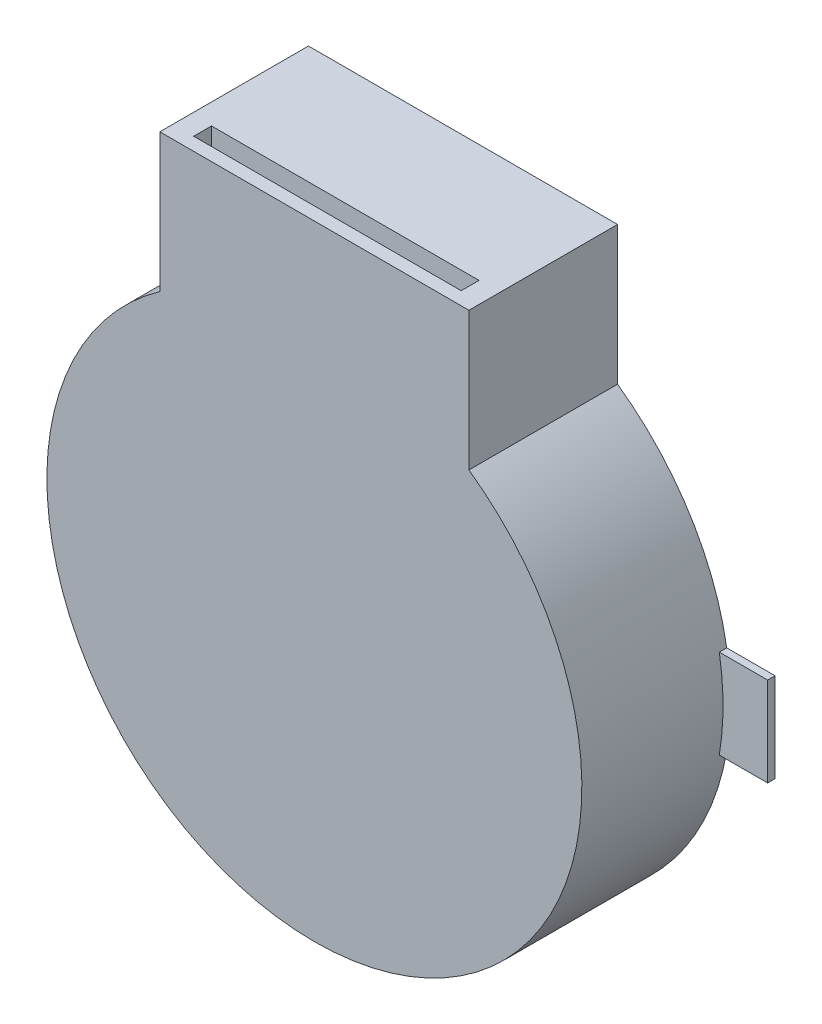
ISO-10303-21;
HEADER;
FILE_DESCRIPTION(('STEP AP214'),'2;1');
FILE_NAME('part.step','',(''),(''),'','','');
FILE_SCHEMA(('AUTOMOTIVE_DESIGN { 1 0 10303 214 1 1 1 1 }'));
ENDSEC;
DATA;
#1=APPLICATION_CONTEXT('core data for automotive mechanical design processes');
#2=APPLICATION_PROTOCOL_DEFINITION('international standard','automotive_design',2000,#1);
#3=PRODUCT_CONTEXT('',#1,'mechanical');
#4=PRODUCT('Part','Part','',(#3));
#5=PRODUCT_RELATED_PRODUCT_CATEGORY('part','',(#4));
#6=PRODUCT_DEFINITION_FORMATION('','',#4);
#7=PRODUCT_DEFINITION_CONTEXT('part definition',#1,'design');
#8=PRODUCT_DEFINITION('design','',#6,#7);
#9=PRODUCT_DEFINITION_SHAPE('','',#8);
#10=(LENGTH_UNIT() NAMED_UNIT(*) SI_UNIT(.MILLI.,.METRE.));
#11=(NAMED_UNIT(*) PLANE_ANGLE_UNIT() SI_UNIT($,.RADIAN.));
#12=(NAMED_UNIT(*) SI_UNIT($,.STERADIAN.) SOLID_ANGLE_UNIT());
#13=UNCERTAINTY_MEASURE_WITH_UNIT(LENGTH_MEASURE(1.E-05),#10,'distance_accuracy_value','');
#14=(GEOMETRIC_REPRESENTATION_CONTEXT(3) GLOBAL_UNCERTAINTY_ASSIGNED_CONTEXT((#13)) GLOBAL_UNIT_ASSIGNED_CONTEXT((#10,
#11,#12)) REPRESENTATION_CONTEXT('',''));
#15=CARTESIAN_POINT('',(0.,0.,0.));
#16=DIRECTION('',(0.,0.,1.));
#17=DIRECTION('',(1.,0.,0.));
#18=AXIS2_PLACEMENT_3D('',#15,#16,#17);
#19=CARTESIAN_POINT('',(-2.25,6.,2.28));
#20=DIRECTION('',(-1.,0.,0.));
#21=DIRECTION('',(0.,0.,1.));
#22=AXIS2_PLACEMENT_3D('',#19,#20,#21);
#23=PLANE('',#22);
#24=DIRECTION('',(0.,0.,-1.));
#25=VECTOR('',#24,1.);
#26=CARTESIAN_POINT('',(-2.25,6.,1.14));
#27=LINE('',#26,#25);
#28=CARTESIAN_POINT('',(-2.25,6.,2.28));
#29=VERTEX_POINT('',#28);
#30=CARTESIAN_POINT('',(-2.25,6.,1.98));
#31=VERTEX_POINT('',#30);
#32=EDGE_CURVE('P0_E264',#29,#31,#27,.T.);
#33=ORIENTED_EDGE('',*,*,#32,.F.);
#34=DIRECTION('',(0.,-1.,0.));
#35=VECTOR('',#34,1.);
#36=CARTESIAN_POINT('',(-2.25,6.,2.28));
#37=LINE('',#36,#35);
#38=CARTESIAN_POINT('',(-2.25,3.677,2.28));
#39=VERTEX_POINT('',#38);
#40=EDGE_CURVE('P0_E11',#29,#39,#37,.T.);
#41=ORIENTED_EDGE('',*,*,#40,.T.);
#42=DIRECTION('',(0.,0.,-1.));
#43=VECTOR('',#42,1.);
#44=CARTESIAN_POINT('',(-2.25,3.677,2.28));
#45=LINE('',#44,#43);
#46=CARTESIAN_POINT('',(-2.25,3.677,1.98));
#47=VERTEX_POINT('',#46);
#48=EDGE_CURVE('P0_E20',#39,#47,#45,.T.);
#49=ORIENTED_EDGE('',*,*,#48,.T.);
#50=DIRECTION('',(0.,-1.,0.));
#51=VECTOR('',#50,1.);
#52=CARTESIAN_POINT('',(-2.25,6.,1.98));
#53=LINE('',#52,#51);
#54=EDGE_CURVE('P0_E125',#31,#47,#53,.T.);
#55=ORIENTED_EDGE('',*,*,#54,.F.);
#56=EDGE_LOOP('',(#33,#41,#49,#55));
#57=FACE_BOUND('',#56,.T.);
#58=ADVANCED_FACE('P0_F16',(#57),#23,.F.);
#59=CARTESIAN_POINT('',(2.25,6.,2.28));
#60=DIRECTION('',(0.,0.,1.));
#61=DIRECTION('',(1.,0.,0.));
#62=AXIS2_PLACEMENT_3D('',#59,#60,#61);
#63=PLANE('',#62);
#64=DIRECTION('',(-1.,0.,0.));
#65=VECTOR('',#64,1.);
#66=CARTESIAN_POINT('',(2.425,6.,2.28));
#67=LINE('',#66,#65);
#68=CARTESIAN_POINT('',(2.25,6.,2.28));
#69=VERTEX_POINT('',#68);
#70=EDGE_CURVE('P0_E315',#69,#29,#67,.T.);
#71=ORIENTED_EDGE('',*,*,#70,.F.);
#72=DIRECTION('',(0.,-1.,0.));
#73=VECTOR('',#72,1.);
#74=CARTESIAN_POINT('',(2.25,6.,2.28));
#75=LINE('',#74,#73);
#76=CARTESIAN_POINT('',(2.25,3.677,2.28));
#77=VERTEX_POINT('',#76);
#78=EDGE_CURVE('P0_E27',#69,#77,#75,.T.);
#79=ORIENTED_EDGE('',*,*,#78,.T.);
#80=DIRECTION('',(-1.,0.,0.));
#81=VECTOR('',#80,1.);
#82=CARTESIAN_POINT('',(2.25,3.677,2.28));
#83=LINE('',#82,#81);
#84=EDGE_CURVE('P0_E305',#77,#39,#83,.T.);
#85=ORIENTED_EDGE('',*,*,#84,.T.);
#86=ORIENTED_EDGE('',*,*,#40,.F.);
#87=EDGE_LOOP('',(#71,#79,#85,#86));
#88=FACE_BOUND('',#87,.T.);
#89=ADVANCED_FACE('P0_F702',(#88),#63,.F.);
#90=CARTESIAN_POINT('',(2.25,6.,1.98));
#91=DIRECTION('',(1.,0.,0.));
#92=DIRECTION('',(0.,1.,0.));
#93=AXIS2_PLACEMENT_3D('',#90,#91,#92);
#94=PLANE('',#93);
#95=DIRECTION('',(0.,0.,1.));
#96=VECTOR('',#95,1.);
#97=CARTESIAN_POINT('',(2.25,6.,0.99));
#98=LINE('',#97,#96);
#99=CARTESIAN_POINT('',(2.25,6.,1.98));
#100=VERTEX_POINT('',#99);
#101=EDGE_CURVE('P0_E301',#100,#69,#98,.T.);
#102=ORIENTED_EDGE('',*,*,#101,.F.);
#103=DIRECTION('',(0.,-1.,0.));
#104=VECTOR('',#103,1.);
#105=CARTESIAN_POINT('',(2.25,6.,1.98));
#106=LINE('',#105,#104);
#107=CARTESIAN_POINT('',(2.25,3.677,1.98));
#108=VERTEX_POINT('',#107);
#109=EDGE_CURVE('P0_E110',#100,#108,#106,.T.);
#110=ORIENTED_EDGE('',*,*,#109,.T.);
#111=DIRECTION('',(0.,0.,1.));
#112=VECTOR('',#111,1.);
#113=CARTESIAN_POINT('',(2.25,3.677,1.98));
#114=LINE('',#113,#112);
#115=EDGE_CURVE('P0_E302',#108,#77,#114,.T.);
#116=ORIENTED_EDGE('',*,*,#115,.T.);
#117=ORIENTED_EDGE('',*,*,#78,.F.);
#118=EDGE_LOOP('',(#102,#110,#116,#117));
#119=FACE_BOUND('',#118,.T.);
#120=ADVANCED_FACE('P0_F641',(#119),#94,.F.);
#121=CARTESIAN_POINT('',(-2.25,6.,1.98));
#122=DIRECTION('',(0.,0.,-1.));
#123=DIRECTION('',(0.,-1.,0.));
#124=AXIS2_PLACEMENT_3D('',#121,#122,#123);
#125=PLANE('',#124);
#126=DIRECTION('',(1.,0.,0.));
#127=VECTOR('',#126,1.);
#128=CARTESIAN_POINT('',(0.175,6.,1.98));
#129=LINE('',#128,#127);
#130=EDGE_CURVE('P0_E267',#31,#100,#129,.T.);
#131=ORIENTED_EDGE('',*,*,#130,.F.);
#132=ORIENTED_EDGE('',*,*,#54,.T.);
#133=DIRECTION('',(1.,0.,0.));
#134=VECTOR('',#133,1.);
#135=CARTESIAN_POINT('',(-2.25,3.677,1.98));
#136=LINE('',#135,#134);
#137=EDGE_CURVE('P0_E481',#47,#108,#136,.T.);
#138=ORIENTED_EDGE('',*,*,#137,.T.);
#139=ORIENTED_EDGE('',*,*,#109,.F.);
#140=EDGE_LOOP('',(#131,#132,#138,#139));
#141=FACE_BOUND('',#140,.T.);
#142=ADVANCED_FACE('P0_F635',(#141),#125,.F.);
#143=CARTESIAN_POINT('',(0.,3.677,2.13));
#144=DIRECTION('',(0.,-1.,0.));
#145=DIRECTION('',(0.,0.,-1.));
#146=AXIS2_PLACEMENT_3D('',#143,#144,#145);
#147=PLANE('',#146);
#148=ORIENTED_EDGE('',*,*,#137,.F.);
#149=ORIENTED_EDGE('',*,*,#48,.F.);
#150=ORIENTED_EDGE('',*,*,#84,.F.);
#151=ORIENTED_EDGE('',*,*,#115,.F.);
#152=EDGE_LOOP('',(#148,#149,#150,#151));
#153=FACE_BOUND('',#152,.T.);
#154=ADVANCED_FACE('P0_F640',(#153),#147,.F.);
#155=CARTESIAN_POINT('',(3.05,-0.75,0.));
#156=DIRECTION('',(0.,-1.,0.));
#157=DIRECTION('',(0.,0.,-1.));
#158=AXIS2_PLACEMENT_3D('',#155,#156,#157);
#159=PLANE('',#158);
#160=DIRECTION('',(0.,0.,1.));
#161=VECTOR('',#160,1.);
#162=CARTESIAN_POINT('',(4.03081877538546,-0.75,0.));
#163=LINE('',#162,#161);
#164=CARTESIAN_POINT('',(4.03081877538546,-0.75,0.));
#165=VERTEX_POINT('',#164);
#166=CARTESIAN_POINT('',(4.03081877538546,-0.75,0.125));
#167=VERTEX_POINT('',#166);
#168=EDGE_CURVE('P0_E346',#165,#167,#163,.T.);
#169=ORIENTED_EDGE('',*,*,#168,.T.);
#170=DIRECTION('',(1.,0.,0.));
#171=VECTOR('',#170,1.);
#172=CARTESIAN_POINT('',(3.05,-0.75,0.125));
#173=LINE('',#172,#171);
#174=CARTESIAN_POINT('',(4.43705983732471,-0.75,0.125));
#175=VERTEX_POINT('',#174);
#176=EDGE_CURVE('P0_E314',#167,#175,#173,.T.);
#177=ORIENTED_EDGE('',*,*,#176,.T.);
#178=DIRECTION('',(0.,0.,1.));
#179=VECTOR('',#178,1.);
#180=CARTESIAN_POINT('',(4.43705983732471,-0.75,0.));
#181=LINE('',#180,#179);
#182=CARTESIAN_POINT('',(4.43705983732471,-0.75,0.));
#183=VERTEX_POINT('',#182);
#184=EDGE_CURVE('P0_E296',#183,#175,#181,.T.);
#185=ORIENTED_EDGE('',*,*,#184,.F.);
#186=DIRECTION('',(1.,0.,0.));
#187=VECTOR('',#186,1.);
#188=CARTESIAN_POINT('',(1.525,-0.75,0.));
#189=LINE('',#188,#187);
#190=EDGE_CURVE('P0_E475',#165,#183,#189,.T.);
#191=ORIENTED_EDGE('',*,*,#190,.F.);
#192=EDGE_LOOP('',(#169,#177,#185,#191));
#193=FACE_BOUND('',#192,.T.);
#194=ADVANCED_FACE('P0_F681',(#193),#159,.F.);
#195=CARTESIAN_POINT('',(5.25,0.75,0.));
#196=DIRECTION('',(0.,1.,0.));
#197=DIRECTION('',(1.,0.,0.));
#198=AXIS2_PLACEMENT_3D('',#195,#196,#197);
#199=PLANE('',#198);
#200=DIRECTION('',(0.,0.,1.));
#201=VECTOR('',#200,1.);
#202=CARTESIAN_POINT('',(4.03081877538546,0.75,0.));
#203=LINE('',#202,#201);
#204=CARTESIAN_POINT('',(4.03081877538546,0.75,0.));
#205=VERTEX_POINT('',#204);
#206=CARTESIAN_POINT('',(4.03081877538546,0.75,0.125));
#207=VERTEX_POINT('',#206);
#208=EDGE_CURVE('P0_E407',#205,#207,#203,.T.);
#209=ORIENTED_EDGE('',*,*,#208,.F.);
#210=DIRECTION('',(-1.,0.,0.));
#211=VECTOR('',#210,1.);
#212=CARTESIAN_POINT('',(2.625,0.75,0.));
#213=LINE('',#212,#211);
#214=CARTESIAN_POINT('',(4.43705983732471,0.75,0.));
#215=VERTEX_POINT('',#214);
#216=EDGE_CURVE('P0_E306',#215,#205,#213,.T.);
#217=ORIENTED_EDGE('',*,*,#216,.F.);
#218=DIRECTION('',(0.,0.,-1.));
#219=VECTOR('',#218,1.);
#220=CARTESIAN_POINT('',(4.43705983732471,0.75,0.));
#221=LINE('',#220,#219);
#222=CARTESIAN_POINT('',(4.43705983732471,0.75,0.125));
#223=VERTEX_POINT('',#222);
#224=EDGE_CURVE('P0_E359',#223,#215,#221,.T.);
#225=ORIENTED_EDGE('',*,*,#224,.F.);
#226=DIRECTION('',(-1.,0.,0.));
#227=VECTOR('',#226,1.);
#228=CARTESIAN_POINT('',(5.25,0.75,0.125));
#229=LINE('',#228,#227);
#230=EDGE_CURVE('P0_E310',#223,#207,#229,.T.);
#231=ORIENTED_EDGE('',*,*,#230,.T.);
#232=EDGE_LOOP('',(#209,#217,#225,#231));
#233=FACE_BOUND('',#232,.T.);
#234=ADVANCED_FACE('P0_F424',(#233),#199,.F.);
#235=CARTESIAN_POINT('',(0.,0.75,0.));
#236=DIRECTION('',(0.,0.,1.));
#237=DIRECTION('',(1.,0.,0.));
#238=AXIS2_PLACEMENT_3D('',#235,#236,#237);
#239=PLANE('',#238);
#240=ORIENTED_EDGE('',*,*,#190,.T.);
#241=CARTESIAN_POINT('',(0.,0.,0.));
#242=DIRECTION('',(0.,0.,1.));
#243=DIRECTION('',(-0.577777777777778,0.816194118764754,0.));
#244=AXIS2_PLACEMENT_3D('',#241,#242,#243);
#245=CIRCLE('',#244,4.5);
#246=CARTESIAN_POINT('',(0.,-4.5,0.));
#247=VERTEX_POINT('',#246);
#248=EDGE_CURVE('P0_E376',#247,#183,#245,.T.);
#249=ORIENTED_EDGE('',*,*,#248,.F.);
#250=CARTESIAN_POINT('',(0.,0.,0.));
#251=DIRECTION('',(0.,0.,1.));
#252=DIRECTION('',(-0.577777777777778,0.816194118764754,0.));
#253=AXIS2_PLACEMENT_3D('',#250,#251,#252);
#254=CIRCLE('',#253,4.5);
#255=CARTESIAN_POINT('',(-4.43705983732471,-0.75,0.));
#256=VERTEX_POINT('',#255);
#257=EDGE_CURVE('P0_E390',#256,#247,#254,.T.);
#258=ORIENTED_EDGE('',*,*,#257,.F.);
#259=DIRECTION('',(1.,0.,0.));
#260=VECTOR('',#259,1.);
#261=CARTESIAN_POINT('',(-2.625,-0.75,0.));
#262=LINE('',#261,#260);
#263=CARTESIAN_POINT('',(-4.03081877538546,-0.75,0.));
#264=VERTEX_POINT('',#263);
#265=EDGE_CURVE('P0_E471',#256,#264,#262,.T.);
#266=ORIENTED_EDGE('',*,*,#265,.T.);
#267=CARTESIAN_POINT('',(0.,0.,0.));
#268=DIRECTION('',(0.,0.,1.));
#269=DIRECTION('',(0.983126530581821,-0.182926829268293,0.));
#270=AXIS2_PLACEMENT_3D('',#267,#268,#269);
#271=CIRCLE('',#270,4.1);
#272=EDGE_CURVE('P0_E347',#264,#165,#271,.T.);
#273=ORIENTED_EDGE('',*,*,#272,.T.);
#274=EDGE_LOOP('',(#240,#249,#258,#266,#273));
#275=FACE_BOUND('',#274,.T.);
#276=ADVANCED_FACE('P0_F598',(#275),#239,.F.);
#277=CARTESIAN_POINT('',(-3.05,0.75,0.));
#278=DIRECTION('',(0.,1.,0.));
#279=DIRECTION('',(1.,0.,0.));
#280=AXIS2_PLACEMENT_3D('',#277,#278,#279);
#281=PLANE('',#280);
#282=DIRECTION('',(0.,0.,1.));
#283=VECTOR('',#282,1.);
#284=CARTESIAN_POINT('',(-4.03081877538546,0.75,0.));
#285=LINE('',#284,#283);
#286=CARTESIAN_POINT('',(-4.03081877538546,0.75,0.));
#287=VERTEX_POINT('',#286);
#288=CARTESIAN_POINT('',(-4.03081877538546,0.75,0.125));
#289=VERTEX_POINT('',#288);
#290=EDGE_CURVE('P0_E367',#287,#289,#285,.T.);
#291=ORIENTED_EDGE('',*,*,#290,.T.);
#292=DIRECTION('',(-1.,0.,0.));
#293=VECTOR('',#292,1.);
#294=CARTESIAN_POINT('',(-3.05,0.75,0.125));
#295=LINE('',#294,#293);
#296=CARTESIAN_POINT('',(-4.43705983732471,0.75,0.125));
#297=VERTEX_POINT('',#296);
#298=EDGE_CURVE('P0_E259',#289,#297,#295,.T.);
#299=ORIENTED_EDGE('',*,*,#298,.T.);
#300=DIRECTION('',(0.,0.,1.));
#301=VECTOR('',#300,1.);
#302=CARTESIAN_POINT('',(-4.43705983732471,0.75,0.));
#303=LINE('',#302,#301);
#304=CARTESIAN_POINT('',(-4.43705983732471,0.75,0.));
#305=VERTEX_POINT('',#304);
#306=EDGE_CURVE('P0_E271',#305,#297,#303,.T.);
#307=ORIENTED_EDGE('',*,*,#306,.F.);
#308=DIRECTION('',(-1.,0.,0.));
#309=VECTOR('',#308,1.);
#310=CARTESIAN_POINT('',(-1.525,0.75,0.));
#311=LINE('',#310,#309);
#312=EDGE_CURVE('P0_E253',#287,#305,#311,.T.);
#313=ORIENTED_EDGE('',*,*,#312,.F.);
#314=EDGE_LOOP('',(#291,#299,#307,#313));
#315=FACE_BOUND('',#314,.T.);
#316=ADVANCED_FACE('P0_F457',(#315),#281,.F.);
#317=CARTESIAN_POINT('',(-5.25,-0.75,0.));
#318=DIRECTION('',(0.,-1.,0.));
#319=DIRECTION('',(0.,0.,-1.));
#320=AXIS2_PLACEMENT_3D('',#317,#318,#319);
#321=PLANE('',#320);
#322=DIRECTION('',(0.,0.,1.));
#323=VECTOR('',#322,1.);
#324=CARTESIAN_POINT('',(-4.03081877538546,-0.75,0.));
#325=LINE('',#324,#323);
#326=CARTESIAN_POINT('',(-4.03081877538546,-0.75,0.125));
#327=VERTEX_POINT('',#326);
#328=EDGE_CURVE('P0_E343',#264,#327,#325,.T.);
#329=ORIENTED_EDGE('',*,*,#328,.F.);
#330=ORIENTED_EDGE('',*,*,#265,.F.);
#331=DIRECTION('',(0.,0.,-1.));
#332=VECTOR('',#331,1.);
#333=CARTESIAN_POINT('',(-4.43705983732471,-0.75,0.));
#334=LINE('',#333,#332);
#335=CARTESIAN_POINT('',(-4.43705983732471,-0.75,0.125));
#336=VERTEX_POINT('',#335);
#337=EDGE_CURVE('P0_E309',#336,#256,#334,.T.);
#338=ORIENTED_EDGE('',*,*,#337,.F.);
#339=DIRECTION('',(1.,0.,0.));
#340=VECTOR('',#339,1.);
#341=CARTESIAN_POINT('',(-5.25,-0.75,0.125));
#342=LINE('',#341,#340);
#343=EDGE_CURVE('P0_E263',#336,#327,#342,.T.);
#344=ORIENTED_EDGE('',*,*,#343,.T.);
#345=EDGE_LOOP('',(#329,#330,#338,#344));
#346=FACE_BOUND('',#345,.T.);
#347=ADVANCED_FACE('P0_F470',(#346),#321,.F.);
#348=CARTESIAN_POINT('',(0.,0.,0.));
#349=DIRECTION('',(0.,0.,1.));
#350=DIRECTION('',(0.983126530581821,-0.182926829268293,0.));
#351=AXIS2_PLACEMENT_3D('',#348,#349,#350);
#352=CYLINDRICAL_SURFACE('',#351,4.1);
#353=ORIENTED_EDGE('',*,*,#272,.F.);
#354=ORIENTED_EDGE('',*,*,#328,.T.);
#355=CARTESIAN_POINT('',(0.,0.,0.125));
#356=DIRECTION('',(0.,0.,1.));
#357=DIRECTION('',(0.983126530581821,-0.182926829268293,0.));
#358=AXIS2_PLACEMENT_3D('',#355,#356,#357);
#359=CIRCLE('',#358,4.1);
#360=EDGE_CURVE('P0_E342',#327,#167,#359,.T.);
#361=ORIENTED_EDGE('',*,*,#360,.T.);
#362=ORIENTED_EDGE('',*,*,#168,.F.);
#363=EDGE_LOOP('',(#353,#354,#361,#362));
#364=FACE_BOUND('',#363,.T.);
#365=ADVANCED_FACE('P0_F501',(#364),#352,.F.);
#366=CARTESIAN_POINT('',(0.,0.,0.));
#367=DIRECTION('',(0.,0.,1.));
#368=DIRECTION('',(-0.983126530581821,0.182926829268293,0.));
#369=AXIS2_PLACEMENT_3D('',#366,#367,#368);
#370=CYLINDRICAL_SURFACE('',#369,4.1);
#371=CARTESIAN_POINT('',(0.,0.,0.));
#372=DIRECTION('',(0.,0.,1.));
#373=DIRECTION('',(-0.983126530581821,0.182926829268293,0.));
#374=AXIS2_PLACEMENT_3D('',#371,#372,#373);
#375=CIRCLE('',#374,4.1);
#376=CARTESIAN_POINT('',(-2.2,3.45976877840123,0.));
#377=VERTEX_POINT('',#376);
#378=EDGE_CURVE('P0_E330',#377,#287,#375,.T.);
#379=ORIENTED_EDGE('',*,*,#378,.F.);
#380=DIRECTION('',(0.,0.,1.));
#381=VECTOR('',#380,1.);
#382=CARTESIAN_POINT('',(-2.2,3.45976877840123,0.));
#383=LINE('',#382,#381);
#384=CARTESIAN_POINT('',(-2.2,3.45976877840123,0.125));
#385=VERTEX_POINT('',#384);
#386=EDGE_CURVE('P0_E364',#377,#385,#383,.T.);
#387=ORIENTED_EDGE('',*,*,#386,.T.);
#388=CARTESIAN_POINT('',(0.,0.,0.125));
#389=DIRECTION('',(0.,0.,1.));
#390=DIRECTION('',(-0.983126530581821,0.182926829268293,0.));
#391=AXIS2_PLACEMENT_3D('',#388,#389,#390);
#392=CIRCLE('',#391,4.1);
#393=EDGE_CURVE('P0_E262',#385,#289,#392,.T.);
#394=ORIENTED_EDGE('',*,*,#393,.T.);
#395=ORIENTED_EDGE('',*,*,#290,.F.);
#396=EDGE_LOOP('',(#379,#387,#394,#395));
#397=FACE_BOUND('',#396,.T.);
#398=ADVANCED_FACE('P0_F453',(#397),#370,.F.);
#399=CARTESIAN_POINT('',(-2.2,4.75,0.));
#400=DIRECTION('',(-1.,0.,0.));
#401=DIRECTION('',(0.,1.,0.));
#402=AXIS2_PLACEMENT_3D('',#399,#400,#401);
#403=PLANE('',#402);
#404=DIRECTION('',(0.,-1.,0.));
#405=VECTOR('',#404,1.);
#406=CARTESIAN_POINT('',(-2.2,2.75,0.));
#407=LINE('',#406,#405);
#408=CARTESIAN_POINT('',(-2.2,4.75,0.));
#409=VERTEX_POINT('',#408);
#410=EDGE_CURVE('P0_E326',#409,#377,#407,.T.);
#411=ORIENTED_EDGE('',*,*,#410,.F.);
#412=DIRECTION('',(0.,0.,1.));
#413=VECTOR('',#412,1.);
#414=CARTESIAN_POINT('',(-2.2,4.75,0.));
#415=LINE('',#414,#413);
#416=CARTESIAN_POINT('',(-2.2,4.75,0.125));
#417=VERTEX_POINT('',#416);
#418=EDGE_CURVE('P0_E368',#409,#417,#415,.T.);
#419=ORIENTED_EDGE('',*,*,#418,.T.);
#420=DIRECTION('',(0.,-1.,0.));
#421=VECTOR('',#420,1.);
#422=CARTESIAN_POINT('',(-2.2,4.75,0.125));
#423=LINE('',#422,#421);
#424=EDGE_CURVE('P0_E319',#417,#385,#423,.T.);
#425=ORIENTED_EDGE('',*,*,#424,.T.);
#426=ORIENTED_EDGE('',*,*,#386,.F.);
#427=EDGE_LOOP('',(#411,#419,#425,#426));
#428=FACE_BOUND('',#427,.T.);
#429=ADVANCED_FACE('P0_F581',(#428),#403,.F.);
#430=CARTESIAN_POINT('',(2.2,4.75,0.));
#431=DIRECTION('',(0.,1.,0.));
#432=DIRECTION('',(1.,0.,0.));
#433=AXIS2_PLACEMENT_3D('',#430,#431,#432);
#434=PLANE('',#433);
#435=DIRECTION('',(-1.,0.,0.));
#436=VECTOR('',#435,1.);
#437=CARTESIAN_POINT('',(1.1,4.75,0.));
#438=LINE('',#437,#436);
#439=CARTESIAN_POINT('',(2.2,4.75,0.));
#440=VERTEX_POINT('',#439);
#441=EDGE_CURVE('P0_E331',#440,#409,#438,.T.);
#442=ORIENTED_EDGE('',*,*,#441,.F.);
#443=DIRECTION('',(0.,0.,1.));
#444=VECTOR('',#443,1.);
#445=CARTESIAN_POINT('',(2.2,4.75,0.));
#446=LINE('',#445,#444);
#447=CARTESIAN_POINT('',(2.2,4.75,0.125));
#448=VERTEX_POINT('',#447);
#449=EDGE_CURVE('P0_E392',#440,#448,#446,.T.);
#450=ORIENTED_EDGE('',*,*,#449,.T.);
#451=DIRECTION('',(-1.,0.,0.));
#452=VECTOR('',#451,1.);
#453=CARTESIAN_POINT('',(2.2,4.75,0.125));
#454=LINE('',#453,#452);
#455=EDGE_CURVE('P0_E323',#448,#417,#454,.T.);
#456=ORIENTED_EDGE('',*,*,#455,.T.);
#457=ORIENTED_EDGE('',*,*,#418,.F.);
#458=EDGE_LOOP('',(#442,#450,#456,#457));
#459=FACE_BOUND('',#458,.T.);
#460=ADVANCED_FACE('P0_F586',(#459),#434,.F.);
#461=CARTESIAN_POINT('',(2.2,3.45976877840123,0.));
#462=DIRECTION('',(1.,0.,0.));
#463=DIRECTION('',(0.,1.,0.));
#464=AXIS2_PLACEMENT_3D('',#461,#462,#463);
#465=PLANE('',#464);
#466=DIRECTION('',(0.,1.,0.));
#467=VECTOR('',#466,1.);
#468=CARTESIAN_POINT('',(2.2,2.10488438920062,0.));
#469=LINE('',#468,#467);
#470=CARTESIAN_POINT('',(2.2,3.45976877840123,0.));
#471=VERTEX_POINT('',#470);
#472=EDGE_CURVE('P0_E433',#471,#440,#469,.T.);
#473=ORIENTED_EDGE('',*,*,#472,.F.);
#474=DIRECTION('',(0.,0.,1.));
#475=VECTOR('',#474,1.);
#476=CARTESIAN_POINT('',(2.2,3.45976877840123,0.));
#477=LINE('',#476,#475);
#478=CARTESIAN_POINT('',(2.2,3.45976877840123,0.125));
#479=VERTEX_POINT('',#478);
#480=EDGE_CURVE('P0_E399',#471,#479,#477,.T.);
#481=ORIENTED_EDGE('',*,*,#480,.T.);
#482=DIRECTION('',(0.,1.,0.));
#483=VECTOR('',#482,1.);
#484=CARTESIAN_POINT('',(2.2,3.45976877840123,0.125));
#485=LINE('',#484,#483);
#486=EDGE_CURVE('P0_E1051',#479,#448,#485,.T.);
#487=ORIENTED_EDGE('',*,*,#486,.T.);
#488=ORIENTED_EDGE('',*,*,#449,.F.);
#489=EDGE_LOOP('',(#473,#481,#487,#488));
#490=FACE_BOUND('',#489,.T.);
#491=ADVANCED_FACE('P0_F671',(#490),#465,.F.);
#492=CARTESIAN_POINT('',(0.,0.,0.));
#493=DIRECTION('',(0.,0.,1.));
#494=DIRECTION('',(0.536585365853659,0.843846043512497,0.));
#495=AXIS2_PLACEMENT_3D('',#492,#493,#494);
#496=CYLINDRICAL_SURFACE('',#495,4.1);
#497=CARTESIAN_POINT('',(0.,0.,0.));
#498=DIRECTION('',(0.,0.,1.));
#499=DIRECTION('',(0.536585365853659,0.843846043512497,0.));
#500=AXIS2_PLACEMENT_3D('',#497,#498,#499);
#501=CIRCLE('',#500,4.1);
#502=EDGE_CURVE('P0_E257',#205,#471,#501,.T.);
#503=ORIENTED_EDGE('',*,*,#502,.F.);
#504=ORIENTED_EDGE('',*,*,#208,.T.);
#505=CARTESIAN_POINT('',(0.,0.,0.125));
#506=DIRECTION('',(0.,0.,1.));
#507=DIRECTION('',(0.536585365853659,0.843846043512497,0.));
#508=AXIS2_PLACEMENT_3D('',#505,#506,#507);
#509=CIRCLE('',#508,4.1);
#510=EDGE_CURVE('P0_E413',#207,#479,#509,.T.);
#511=ORIENTED_EDGE('',*,*,#510,.T.);
#512=ORIENTED_EDGE('',*,*,#480,.F.);
#513=EDGE_LOOP('',(#503,#504,#511,#512));
#514=FACE_BOUND('',#513,.T.);
#515=ADVANCED_FACE('P0_F429',(#514),#496,.F.);
#516=CARTESIAN_POINT('',(0.,0.75,0.125));
#517=DIRECTION('',(0.,0.,-1.));
#518=DIRECTION('',(0.,-1.,0.));
#519=AXIS2_PLACEMENT_3D('',#516,#517,#518);
#520=PLANE('',#519);
#521=ORIENTED_EDGE('',*,*,#230,.F.);
#522=CARTESIAN_POINT('',(0.,0.,0.125));
#523=DIRECTION('',(0.,0.,1.));
#524=DIRECTION('',(-0.577777777777778,0.816194118764754,0.));
#525=AXIS2_PLACEMENT_3D('',#522,#523,#524);
#526=CIRCLE('',#525,4.5);
#527=EDGE_CURVE('P0_E356',#175,#223,#526,.T.);
#528=ORIENTED_EDGE('',*,*,#527,.F.);
#529=ORIENTED_EDGE('',*,*,#176,.F.);
#530=ORIENTED_EDGE('',*,*,#360,.F.);
#531=ORIENTED_EDGE('',*,*,#343,.F.);
#532=CARTESIAN_POINT('',(0.,0.,0.125));
#533=DIRECTION('',(0.,0.,1.));
#534=DIRECTION('',(-0.577777777777778,0.816194118764754,0.));
#535=AXIS2_PLACEMENT_3D('',#532,#533,#534);
#536=CIRCLE('',#535,4.5);
#537=EDGE_CURVE('P0_E280',#297,#336,#536,.T.);
#538=ORIENTED_EDGE('',*,*,#537,.F.);
#539=ORIENTED_EDGE('',*,*,#298,.F.);
#540=ORIENTED_EDGE('',*,*,#393,.F.);
#541=ORIENTED_EDGE('',*,*,#424,.F.);
#542=ORIENTED_EDGE('',*,*,#455,.F.);
#543=ORIENTED_EDGE('',*,*,#486,.F.);
#544=ORIENTED_EDGE('',*,*,#510,.F.);
#545=EDGE_LOOP('',(#521,#528,#529,#530,#531,#538,#539,#540,#541,#542,#543,#544));
#546=FACE_BOUND('',#545,.T.);
#547=ADVANCED_FACE('P0_F464',(#546),#520,.T.);
#548=CARTESIAN_POINT('',(-2.6,6.,0.));
#549=DIRECTION('',(-1.,0.,0.));
#550=DIRECTION('',(0.,0.,1.));
#551=AXIS2_PLACEMENT_3D('',#548,#549,#550);
#552=PLANE('',#551);
#553=DIRECTION('',(0.,-1.,0.));
#554=VECTOR('',#553,1.);
#555=CARTESIAN_POINT('',(-2.6,6.,0.));
#556=LINE('',#555,#554);
#557=CARTESIAN_POINT('',(-2.6,6.,0.));
#558=VERTEX_POINT('',#557);
#559=CARTESIAN_POINT('',(-2.6,3.67287353444139,0.));
#560=VERTEX_POINT('',#559);
#561=EDGE_CURVE('P0_E246',#558,#560,#556,.T.);
#562=ORIENTED_EDGE('',*,*,#561,.T.);
#563=DIRECTION('',(0.,0.,1.));
#564=VECTOR('',#563,1.);
#565=CARTESIAN_POINT('',(-2.6,3.67287353444139,0.));
#566=LINE('',#565,#564);
#567=CARTESIAN_POINT('',(-2.6,3.67287353444139,2.5));
#568=VERTEX_POINT('',#567);
#569=EDGE_CURVE('P0_E272',#560,#568,#566,.T.);
#570=ORIENTED_EDGE('',*,*,#569,.T.);
#571=DIRECTION('',(0.,-1.,0.));
#572=VECTOR('',#571,1.);
#573=CARTESIAN_POINT('',(-2.6,6.,2.5));
#574=LINE('',#573,#572);
#575=CARTESIAN_POINT('',(-2.6,6.,2.5));
#576=VERTEX_POINT('',#575);
#577=EDGE_CURVE('P0_E336',#576,#568,#574,.T.);
#578=ORIENTED_EDGE('',*,*,#577,.F.);
#579=DIRECTION('',(0.,0.,1.));
#580=VECTOR('',#579,1.);
#581=CARTESIAN_POINT('',(-2.6,6.,0.));
#582=LINE('',#581,#580);
#583=EDGE_CURVE('P0_E234',#558,#576,#582,.T.);
#584=ORIENTED_EDGE('',*,*,#583,.F.);
#585=EDGE_LOOP('',(#562,#570,#578,#584));
#586=FACE_BOUND('',#585,.T.);
#587=ADVANCED_FACE('P0_F606',(#586),#552,.T.);
#588=CARTESIAN_POINT('',(2.6,6.,0.));
#589=DIRECTION('',(0.,1.,0.));
#590=DIRECTION('',(1.,0.,0.));
#591=AXIS2_PLACEMENT_3D('',#588,#589,#590);
#592=PLANE('',#591);
#593=ORIENTED_EDGE('',*,*,#32,.T.);
#594=ORIENTED_EDGE('',*,*,#130,.T.);
#595=ORIENTED_EDGE('',*,*,#101,.T.);
#596=ORIENTED_EDGE('',*,*,#70,.T.);
#597=EDGE_LOOP('',(#593,#594,#595,#596));
#598=FACE_BOUND('',#597,.T.);
#599=DIRECTION('',(-1.,0.,0.));
#600=VECTOR('',#599,1.);
#601=CARTESIAN_POINT('',(2.6,6.,0.));
#602=LINE('',#601,#600);
#603=CARTESIAN_POINT('',(2.6,6.,0.));
#604=VERTEX_POINT('',#603);
#605=EDGE_CURVE('P0_E228',#604,#558,#602,.T.);
#606=ORIENTED_EDGE('',*,*,#605,.T.);
#607=ORIENTED_EDGE('',*,*,#583,.T.);
#608=DIRECTION('',(-1.,0.,0.));
#609=VECTOR('',#608,1.);
#610=CARTESIAN_POINT('',(2.6,6.,2.5));
#611=LINE('',#610,#609);
#612=CARTESIAN_POINT('',(2.6,6.,2.5));
#613=VERTEX_POINT('',#612);
#614=EDGE_CURVE('P0_E231',#613,#576,#611,.T.);
#615=ORIENTED_EDGE('',*,*,#614,.F.);
#616=DIRECTION('',(0.,0.,1.));
#617=VECTOR('',#616,1.);
#618=CARTESIAN_POINT('',(2.6,6.,0.));
#619=LINE('',#618,#617);
#620=EDGE_CURVE('P0_E225',#604,#613,#619,.T.);
#621=ORIENTED_EDGE('',*,*,#620,.F.);
#622=EDGE_LOOP('',(#606,#607,#615,#621));
#623=FACE_BOUND('',#622,.T.);
#624=ADVANCED_FACE('P0_F226',(#598,#623),#592,.T.);
#625=CARTESIAN_POINT('',(2.6,3.67287353444139,0.));
#626=DIRECTION('',(1.,0.,0.));
#627=DIRECTION('',(0.,1.,0.));
#628=AXIS2_PLACEMENT_3D('',#625,#626,#627);
#629=PLANE('',#628);
#630=DIRECTION('',(0.,1.,0.));
#631=VECTOR('',#630,1.);
#632=CARTESIAN_POINT('',(2.6,3.67287353444139,0.));
#633=LINE('',#632,#631);
#634=CARTESIAN_POINT('',(2.6,3.67287353444139,0.));
#635=VERTEX_POINT('',#634);
#636=EDGE_CURVE('P0_E237',#635,#604,#633,.T.);
#637=ORIENTED_EDGE('',*,*,#636,.T.);
#638=ORIENTED_EDGE('',*,*,#620,.T.);
#639=DIRECTION('',(0.,1.,0.));
#640=VECTOR('',#639,1.);
#641=CARTESIAN_POINT('',(2.6,3.67287353444139,2.5));
#642=LINE('',#641,#640);
#643=CARTESIAN_POINT('',(2.6,3.67287353444139,2.5));
#644=VERTEX_POINT('',#643);
#645=EDGE_CURVE('P0_E337',#644,#613,#642,.T.);
#646=ORIENTED_EDGE('',*,*,#645,.F.);
#647=DIRECTION('',(0.,0.,1.));
#648=VECTOR('',#647,1.);
#649=CARTESIAN_POINT('',(2.6,3.67287353444139,0.));
#650=LINE('',#649,#648);
#651=EDGE_CURVE('P0_E216',#635,#644,#650,.T.);
#652=ORIENTED_EDGE('',*,*,#651,.F.);
#653=EDGE_LOOP('',(#637,#638,#646,#652));
#654=FACE_BOUND('',#653,.T.);
#655=ADVANCED_FACE('P0_F18',(#654),#629,.T.);
#656=CARTESIAN_POINT('',(0.,0.,0.));
#657=DIRECTION('',(0.,0.,1.));
#658=DIRECTION('',(0.,-1.,0.));
#659=AXIS2_PLACEMENT_3D('',#656,#657,#658);
#660=CYLINDRICAL_SURFACE('',#659,4.5);
#661=DIRECTION('',(0.,0.,1.));
#662=VECTOR('',#661,1.);
#663=CARTESIAN_POINT('',(0.,-4.5,0.));
#664=LINE('',#663,#662);
#665=CARTESIAN_POINT('',(0.,-4.5,2.5));
#666=VERTEX_POINT('',#665);
#667=EDGE_CURVE('P0_E292',#247,#666,#664,.T.);
#668=ORIENTED_EDGE('',*,*,#667,.F.);
#669=ORIENTED_EDGE('',*,*,#248,.T.);
#670=ORIENTED_EDGE('',*,*,#184,.T.);
#671=ORIENTED_EDGE('',*,*,#527,.T.);
#672=ORIENTED_EDGE('',*,*,#224,.T.);
#673=CARTESIAN_POINT('',(0.,0.,0.));
#674=DIRECTION('',(0.,0.,1.));
#675=DIRECTION('',(-0.577777777777778,0.816194118764754,0.));
#676=AXIS2_PLACEMENT_3D('',#673,#674,#675);
#677=CIRCLE('',#676,4.5);
#678=EDGE_CURVE('P0_E241',#215,#635,#677,.T.);
#679=ORIENTED_EDGE('',*,*,#678,.T.);
#680=ORIENTED_EDGE('',*,*,#651,.T.);
#681=CARTESIAN_POINT('',(0.,0.,2.5));
#682=DIRECTION('',(0.,0.,1.));
#683=DIRECTION('',(-0.577777777777778,0.816194118764754,0.));
#684=AXIS2_PLACEMENT_3D('',#681,#682,#683);
#685=CIRCLE('',#684,4.5);
#686=EDGE_CURVE('P0_E355',#666,#644,#685,.T.);
#687=ORIENTED_EDGE('',*,*,#686,.F.);
#688=EDGE_LOOP('',(#668,#669,#670,#671,#672,#679,#680,#687));
#689=FACE_BOUND('',#688,.T.);
#690=ADVANCED_FACE('P0_F419',(#689),#660,.T.);
#691=CARTESIAN_POINT('',(0.,0.75,2.5));
#692=DIRECTION('',(0.,0.,1.));
#693=DIRECTION('',(1.,0.,0.));
#694=AXIS2_PLACEMENT_3D('',#691,#692,#693);
#695=PLANE('',#694);
#696=CARTESIAN_POINT('',(0.,0.,2.5));
#697=DIRECTION('',(0.,0.,1.));
#698=DIRECTION('',(-0.577777777777778,0.816194118764754,0.));
#699=AXIS2_PLACEMENT_3D('',#696,#697,#698);
#700=CIRCLE('',#699,4.5);
#701=EDGE_CURVE('P0_E283',#568,#666,#700,.T.);
#702=ORIENTED_EDGE('',*,*,#701,.T.);
#703=ORIENTED_EDGE('',*,*,#686,.T.);
#704=ORIENTED_EDGE('',*,*,#645,.T.);
#705=ORIENTED_EDGE('',*,*,#614,.T.);
#706=ORIENTED_EDGE('',*,*,#577,.T.);
#707=EDGE_LOOP('',(#702,#703,#704,#705,#706));
#708=FACE_BOUND('',#707,.T.);
#709=ADVANCED_FACE('P0_F731',(#708),#695,.T.);
#710=CARTESIAN_POINT('',(0.,0.75,0.));
#711=DIRECTION('',(0.,0.,1.));
#712=DIRECTION('',(1.,0.,0.));
#713=AXIS2_PLACEMENT_3D('',#710,#711,#712);
#714=PLANE('',#713);
#715=ORIENTED_EDGE('',*,*,#216,.T.);
#716=ORIENTED_EDGE('',*,*,#502,.T.);
#717=ORIENTED_EDGE('',*,*,#472,.T.);
#718=ORIENTED_EDGE('',*,*,#441,.T.);
#719=ORIENTED_EDGE('',*,*,#410,.T.);
#720=ORIENTED_EDGE('',*,*,#378,.T.);
#721=ORIENTED_EDGE('',*,*,#312,.T.);
#722=CARTESIAN_POINT('',(0.,0.,0.));
#723=DIRECTION('',(0.,0.,1.));
#724=DIRECTION('',(-0.577777777777778,0.816194118764754,0.));
#725=AXIS2_PLACEMENT_3D('',#722,#723,#724);
#726=CIRCLE('',#725,4.5);
#727=EDGE_CURVE('P0_E268',#560,#305,#726,.T.);
#728=ORIENTED_EDGE('',*,*,#727,.F.);
#729=ORIENTED_EDGE('',*,*,#561,.F.);
#730=ORIENTED_EDGE('',*,*,#605,.F.);
#731=ORIENTED_EDGE('',*,*,#636,.F.);
#732=ORIENTED_EDGE('',*,*,#678,.F.);
#733=EDGE_LOOP('',(#715,#716,#717,#718,#719,#720,#721,#728,#729,#730,#731,#732));
#734=FACE_BOUND('',#733,.T.);
#735=ADVANCED_FACE('P0_F244',(#734),#714,.F.);
#736=CARTESIAN_POINT('',(0.,0.,0.));
#737=DIRECTION('',(0.,0.,1.));
#738=DIRECTION('',(0.,-1.,0.));
#739=AXIS2_PLACEMENT_3D('',#736,#737,#738);
#740=CYLINDRICAL_SURFACE('',#739,4.5);
#741=ORIENTED_EDGE('',*,*,#257,.T.);
#742=ORIENTED_EDGE('',*,*,#667,.T.);
#743=ORIENTED_EDGE('',*,*,#701,.F.);
#744=ORIENTED_EDGE('',*,*,#569,.F.);
#745=ORIENTED_EDGE('',*,*,#727,.T.);
#746=ORIENTED_EDGE('',*,*,#306,.T.);
#747=ORIENTED_EDGE('',*,*,#537,.T.);
#748=ORIENTED_EDGE('',*,*,#337,.T.);
#749=EDGE_LOOP('',(#741,#742,#743,#744,#745,#746,#747,#748));
#750=FACE_BOUND('',#749,.T.);
#751=ADVANCED_FACE('P0_F460',(#750),#740,.T.);
#752=CLOSED_SHELL('',(#58,#89,#120,#142,#154,#194,#234,#276,#316,#347,#365,#398,#429,#460,#491,
#515,#547,#587,#624,#655,#690,#709,#735,#751));
#753=MANIFOLD_SOLID_BREP('P0_B1',#752);
#754=CARTESIAN_POINT('',(-5.25,-0.75,0.));
#755=DIRECTION('',(0.,-1.,0.));
#756=DIRECTION('',(0.,0.,-1.));
#757=AXIS2_PLACEMENT_3D('',#754,#755,#756);
#758=PLANE('',#757);
#759=DIRECTION('',(1.,0.,0.));
#760=VECTOR('',#759,1.);
#761=CARTESIAN_POINT('',(-5.25,-0.75,0.));
#762=LINE('',#761,#760);
#763=CARTESIAN_POINT('',(-5.25,-0.75,0.));
#764=VERTEX_POINT('',#763);
#765=CARTESIAN_POINT('',(-3.05,-0.75,0.));
#766=VERTEX_POINT('',#765);
#767=EDGE_CURVE('P1_E105',#764,#766,#762,.T.);
#768=ORIENTED_EDGE('',*,*,#767,.T.);
#769=DIRECTION('',(0.,0.,1.));
#770=VECTOR('',#769,1.);
#771=CARTESIAN_POINT('',(-3.05,-0.75,0.));
#772=LINE('',#771,#770);
#773=CARTESIAN_POINT('',(-3.05,-0.75,0.125));
#774=VERTEX_POINT('',#773);
#775=EDGE_CURVE('P1_E80',#766,#774,#772,.T.);
#776=ORIENTED_EDGE('',*,*,#775,.T.);
#777=DIRECTION('',(1.,0.,0.));
#778=VECTOR('',#777,1.);
#779=CARTESIAN_POINT('',(-5.25,-0.75,0.125));
#780=LINE('',#779,#778);
#781=CARTESIAN_POINT('',(-5.25,-0.75,0.125));
#782=VERTEX_POINT('',#781);
#783=EDGE_CURVE('P1_E93',#782,#774,#780,.T.);
#784=ORIENTED_EDGE('',*,*,#783,.F.);
#785=DIRECTION('',(0.,0.,1.));
#786=VECTOR('',#785,1.);
#787=CARTESIAN_POINT('',(-5.25,-0.75,0.));
#788=LINE('',#787,#786);
#789=EDGE_CURVE('P1_E11',#764,#782,#788,.T.);
#790=ORIENTED_EDGE('',*,*,#789,.F.);
#791=EDGE_LOOP('',(#768,#776,#784,#790));
#792=FACE_BOUND('',#791,.T.);
#793=ADVANCED_FACE('P1_F16',(#792),#758,.T.);
#794=CARTESIAN_POINT('',(-5.25,0.75,0.));
#795=DIRECTION('',(-1.,0.,0.));
#796=DIRECTION('',(0.,1.,0.));
#797=AXIS2_PLACEMENT_3D('',#794,#795,#796);
#798=PLANE('',#797);
#799=DIRECTION('',(0.,-1.,0.));
#800=VECTOR('',#799,1.);
#801=CARTESIAN_POINT('',(-5.25,0.75,0.));
#802=LINE('',#801,#800);
#803=CARTESIAN_POINT('',(-5.25,0.75,0.));
#804=VERTEX_POINT('',#803);
#805=EDGE_CURVE('P1_E111',#804,#764,#802,.T.);
#806=ORIENTED_EDGE('',*,*,#805,.T.);
#807=ORIENTED_EDGE('',*,*,#789,.T.);
#808=DIRECTION('',(0.,-1.,0.));
#809=VECTOR('',#808,1.);
#810=CARTESIAN_POINT('',(-5.25,0.75,0.125));
#811=LINE('',#810,#809);
#812=CARTESIAN_POINT('',(-5.25,0.75,0.125));
#813=VERTEX_POINT('',#812);
#814=EDGE_CURVE('P1_E88',#813,#782,#811,.T.);
#815=ORIENTED_EDGE('',*,*,#814,.F.);
#816=DIRECTION('',(0.,0.,1.));
#817=VECTOR('',#816,1.);
#818=CARTESIAN_POINT('',(-5.25,0.75,0.));
#819=LINE('',#818,#817);
#820=EDGE_CURVE('P1_E27',#804,#813,#819,.T.);
#821=ORIENTED_EDGE('',*,*,#820,.F.);
#822=EDGE_LOOP('',(#806,#807,#815,#821));
#823=FACE_BOUND('',#822,.T.);
#824=ADVANCED_FACE('P1_F161',(#823),#798,.T.);
#825=CARTESIAN_POINT('',(-3.05,0.75,0.));
#826=DIRECTION('',(0.,1.,0.));
#827=DIRECTION('',(1.,0.,0.));
#828=AXIS2_PLACEMENT_3D('',#825,#826,#827);
#829=PLANE('',#828);
#830=DIRECTION('',(-1.,0.,0.));
#831=VECTOR('',#830,1.);
#832=CARTESIAN_POINT('',(-3.05,0.75,0.));
#833=LINE('',#832,#831);
#834=CARTESIAN_POINT('',(-3.05,0.75,0.));
#835=VERTEX_POINT('',#834);
#836=EDGE_CURVE('P1_E81',#835,#804,#833,.T.);
#837=ORIENTED_EDGE('',*,*,#836,.T.);
#838=ORIENTED_EDGE('',*,*,#820,.T.);
#839=DIRECTION('',(-1.,0.,0.));
#840=VECTOR('',#839,1.);
#841=CARTESIAN_POINT('',(-3.05,0.75,0.125));
#842=LINE('',#841,#840);
#843=CARTESIAN_POINT('',(-3.05,0.75,0.125));
#844=VERTEX_POINT('',#843);
#845=EDGE_CURVE('P1_E83',#844,#813,#842,.T.);
#846=ORIENTED_EDGE('',*,*,#845,.F.);
#847=DIRECTION('',(0.,0.,1.));
#848=VECTOR('',#847,1.);
#849=CARTESIAN_POINT('',(-3.05,0.75,0.));
#850=LINE('',#849,#848);
#851=EDGE_CURVE('P1_E20',#835,#844,#850,.T.);
#852=ORIENTED_EDGE('',*,*,#851,.F.);
#853=EDGE_LOOP('',(#837,#838,#846,#852));
#854=FACE_BOUND('',#853,.T.);
#855=ADVANCED_FACE('P1_F84',(#854),#829,.T.);
#856=CARTESIAN_POINT('',(-3.05,-0.75,0.));
#857=DIRECTION('',(1.,0.,0.));
#858=DIRECTION('',(0.,1.,0.));
#859=AXIS2_PLACEMENT_3D('',#856,#857,#858);
#860=PLANE('',#859);
#861=DIRECTION('',(0.,-1.,0.));
#862=VECTOR('',#861,1.);
#863=CARTESIAN_POINT('',(-3.05,0.75,0.));
#864=LINE('',#863,#862);
#865=EDGE_CURVE('P1_E77',#835,#766,#864,.T.);
#866=ORIENTED_EDGE('',*,*,#865,.F.);
#867=ORIENTED_EDGE('',*,*,#851,.T.);
#868=DIRECTION('',(0.,1.,0.));
#869=VECTOR('',#868,1.);
#870=CARTESIAN_POINT('',(-3.05,0.75,0.125));
#871=LINE('',#870,#869);
#872=EDGE_CURVE('P1_E75',#774,#844,#871,.T.);
#873=ORIENTED_EDGE('',*,*,#872,.F.);
#874=ORIENTED_EDGE('',*,*,#775,.F.);
#875=EDGE_LOOP('',(#866,#867,#873,#874));
#876=FACE_BOUND('',#875,.T.);
#877=ADVANCED_FACE('P1_F72',(#876),#860,.T.);
#878=CARTESIAN_POINT('',(-4.15,0.,0.));
#879=DIRECTION('',(0.,0.,-1.));
#880=DIRECTION('',(0.,-1.,0.));
#881=AXIS2_PLACEMENT_3D('',#878,#879,#880);
#882=PLANE('',#881);
#883=ORIENTED_EDGE('',*,*,#865,.T.);
#884=ORIENTED_EDGE('',*,*,#767,.F.);
#885=ORIENTED_EDGE('',*,*,#805,.F.);
#886=ORIENTED_EDGE('',*,*,#836,.F.);
#887=EDGE_LOOP('',(#883,#884,#885,#886));
#888=FACE_BOUND('',#887,.T.);
#889=ADVANCED_FACE('P1_F18',(#888),#882,.T.);
#890=CARTESIAN_POINT('',(-4.15,0.,0.125));
#891=DIRECTION('',(0.,0.,1.));
#892=DIRECTION('',(1.,0.,0.));
#893=AXIS2_PLACEMENT_3D('',#890,#891,#892);
#894=PLANE('',#893);
#895=ORIENTED_EDGE('',*,*,#872,.T.);
#896=ORIENTED_EDGE('',*,*,#845,.T.);
#897=ORIENTED_EDGE('',*,*,#814,.T.);
#898=ORIENTED_EDGE('',*,*,#783,.T.);
#899=EDGE_LOOP('',(#895,#896,#897,#898));
#900=FACE_BOUND('',#899,.T.);
#901=ADVANCED_FACE('P1_F91',(#900),#894,.T.);
#902=CLOSED_SHELL('',(#793,#824,#855,#877,#889,#901));
#903=MANIFOLD_SOLID_BREP('P1_B1',#902);
#904=CARTESIAN_POINT('',(5.25,0.75,0.));
#905=DIRECTION('',(0.,1.,0.));
#906=DIRECTION('',(1.,0.,0.));
#907=AXIS2_PLACEMENT_3D('',#904,#905,#906);
#908=PLANE('',#907);
#909=DIRECTION('',(-1.,0.,0.));
#910=VECTOR('',#909,1.);
#911=CARTESIAN_POINT('',(5.25,0.75,0.));
#912=LINE('',#911,#910);
#913=CARTESIAN_POINT('',(5.25,0.75,0.));
#914=VERTEX_POINT('',#913);
#915=CARTESIAN_POINT('',(3.05,0.75,0.));
#916=VERTEX_POINT('',#915);
#917=EDGE_CURVE('P2_E103',#914,#916,#912,.T.);
#918=ORIENTED_EDGE('',*,*,#917,.T.);
#919=DIRECTION('',(0.,0.,1.));
#920=VECTOR('',#919,1.);
#921=CARTESIAN_POINT('',(3.05,0.75,0.));
#922=LINE('',#921,#920);
#923=CARTESIAN_POINT('',(3.05,0.75,0.125));
#924=VERTEX_POINT('',#923);
#925=EDGE_CURVE('P2_E82',#916,#924,#922,.T.);
#926=ORIENTED_EDGE('',*,*,#925,.T.);
#927=DIRECTION('',(-1.,0.,0.));
#928=VECTOR('',#927,1.);
#929=CARTESIAN_POINT('',(5.25,0.75,0.125));
#930=LINE('',#929,#928);
#931=CARTESIAN_POINT('',(5.25,0.75,0.125));
#932=VERTEX_POINT('',#931);
#933=EDGE_CURVE('P2_E94',#932,#924,#930,.T.);
#934=ORIENTED_EDGE('',*,*,#933,.F.);
#935=DIRECTION('',(0.,0.,1.));
#936=VECTOR('',#935,1.);
#937=CARTESIAN_POINT('',(5.25,0.75,0.));
#938=LINE('',#937,#936);
#939=EDGE_CURVE('P2_E11',#914,#932,#938,.T.);
#940=ORIENTED_EDGE('',*,*,#939,.F.);
#941=EDGE_LOOP('',(#918,#926,#934,#940));
#942=FACE_BOUND('',#941,.T.);
#943=ADVANCED_FACE('P2_F16',(#942),#908,.T.);
#944=CARTESIAN_POINT('',(5.25,-0.75,0.));
#945=DIRECTION('',(1.,0.,0.));
#946=DIRECTION('',(0.,1.,0.));
#947=AXIS2_PLACEMENT_3D('',#944,#945,#946);
#948=PLANE('',#947);
#949=DIRECTION('',(0.,1.,0.));
#950=VECTOR('',#949,1.);
#951=CARTESIAN_POINT('',(5.25,-0.75,0.));
#952=LINE('',#951,#950);
#953=CARTESIAN_POINT('',(5.25,-0.75,0.));
#954=VERTEX_POINT('',#953);
#955=EDGE_CURVE('P2_E107',#954,#914,#952,.T.);
#956=ORIENTED_EDGE('',*,*,#955,.T.);
#957=ORIENTED_EDGE('',*,*,#939,.T.);
#958=DIRECTION('',(0.,1.,0.));
#959=VECTOR('',#958,1.);
#960=CARTESIAN_POINT('',(5.25,-0.75,0.125));
#961=LINE('',#960,#959);
#962=CARTESIAN_POINT('',(5.25,-0.75,0.125));
#963=VERTEX_POINT('',#962);
#964=EDGE_CURVE('P2_E20',#963,#932,#961,.T.);
#965=ORIENTED_EDGE('',*,*,#964,.F.);
#966=DIRECTION('',(0.,0.,1.));
#967=VECTOR('',#966,1.);
#968=CARTESIAN_POINT('',(5.25,-0.75,0.));
#969=LINE('',#968,#967);
#970=EDGE_CURVE('P2_E27',#954,#963,#969,.T.);
#971=ORIENTED_EDGE('',*,*,#970,.F.);
#972=EDGE_LOOP('',(#956,#957,#965,#971));
#973=FACE_BOUND('',#972,.T.);
#974=ADVANCED_FACE('P2_F125',(#973),#948,.T.);
#975=CARTESIAN_POINT('',(3.05,-0.75,0.));
#976=DIRECTION('',(0.,-1.,0.));
#977=DIRECTION('',(0.,0.,-1.));
#978=AXIS2_PLACEMENT_3D('',#975,#976,#977);
#979=PLANE('',#978);
#980=DIRECTION('',(1.,0.,0.));
#981=VECTOR('',#980,1.);
#982=CARTESIAN_POINT('',(3.05,-0.75,0.));
#983=LINE('',#982,#981);
#984=CARTESIAN_POINT('',(3.05,-0.75,0.));
#985=VERTEX_POINT('',#984);
#986=EDGE_CURVE('P2_E83',#985,#954,#983,.T.);
#987=ORIENTED_EDGE('',*,*,#986,.T.);
#988=ORIENTED_EDGE('',*,*,#970,.T.);
#989=DIRECTION('',(1.,0.,0.));
#990=VECTOR('',#989,1.);
#991=CARTESIAN_POINT('',(3.05,-0.75,0.125));
#992=LINE('',#991,#990);
#993=CARTESIAN_POINT('',(3.05,-0.75,0.125));
#994=VERTEX_POINT('',#993);
#995=EDGE_CURVE('P2_E86',#994,#963,#992,.T.);
#996=ORIENTED_EDGE('',*,*,#995,.F.);
#997=DIRECTION('',(0.,0.,1.));
#998=VECTOR('',#997,1.);
#999=CARTESIAN_POINT('',(3.05,-0.75,0.));
#1000=LINE('',#999,#998);
#1001=EDGE_CURVE('P2_E74',#985,#994,#1000,.T.);
#1002=ORIENTED_EDGE('',*,*,#1001,.F.);
#1003=EDGE_LOOP('',(#987,#988,#996,#1002));
#1004=FACE_BOUND('',#1003,.T.);
#1005=ADVANCED_FACE('P2_F18',(#1004),#979,.T.);
#1006=CARTESIAN_POINT('',(3.05,0.75,0.));
#1007=DIRECTION('',(-1.,0.,0.));
#1008=DIRECTION('',(0.,1.,0.));
#1009=AXIS2_PLACEMENT_3D('',#1006,#1007,#1008);
#1010=PLANE('',#1009);
#1011=DIRECTION('',(0.,-1.,0.));
#1012=VECTOR('',#1011,1.);
#1013=CARTESIAN_POINT('',(3.05,0.75,0.));
#1014=LINE('',#1013,#1012);
#1015=EDGE_CURVE('P2_E79',#916,#985,#1014,.T.);
#1016=ORIENTED_EDGE('',*,*,#1015,.T.);
#1017=ORIENTED_EDGE('',*,*,#1001,.T.);
#1018=DIRECTION('',(0.,-1.,0.));
#1019=VECTOR('',#1018,1.);
#1020=CARTESIAN_POINT('',(3.05,0.75,0.125));
#1021=LINE('',#1020,#1019);
#1022=EDGE_CURVE('P2_E77',#924,#994,#1021,.T.);
#1023=ORIENTED_EDGE('',*,*,#1022,.F.);
#1024=ORIENTED_EDGE('',*,*,#925,.F.);
#1025=EDGE_LOOP('',(#1016,#1017,#1023,#1024));
#1026=FACE_BOUND('',#1025,.T.);
#1027=ADVANCED_FACE('P2_F75',(#1026),#1010,.T.);
#1028=CARTESIAN_POINT('',(4.15,0.,0.));
#1029=DIRECTION('',(0.,0.,-1.));
#1030=DIRECTION('',(0.,-1.,0.));
#1031=AXIS2_PLACEMENT_3D('',#1028,#1029,#1030);
#1032=PLANE('',#1031);
#1033=ORIENTED_EDGE('',*,*,#1015,.F.);
#1034=ORIENTED_EDGE('',*,*,#917,.F.);
#1035=ORIENTED_EDGE('',*,*,#955,.F.);
#1036=ORIENTED_EDGE('',*,*,#986,.F.);
#1037=EDGE_LOOP('',(#1033,#1034,#1035,#1036));
#1038=FACE_BOUND('',#1037,.T.);
#1039=ADVANCED_FACE('P2_F124',(#1038),#1032,.T.);
#1040=CARTESIAN_POINT('',(4.15,0.,0.125));
#1041=DIRECTION('',(0.,0.,1.));
#1042=DIRECTION('',(1.,0.,0.));
#1043=AXIS2_PLACEMENT_3D('',#1040,#1041,#1042);
#1044=PLANE('',#1043);
#1045=ORIENTED_EDGE('',*,*,#1022,.T.);
#1046=ORIENTED_EDGE('',*,*,#995,.T.);
#1047=ORIENTED_EDGE('',*,*,#964,.T.);
#1048=ORIENTED_EDGE('',*,*,#933,.T.);
#1049=EDGE_LOOP('',(#1045,#1046,#1047,#1048));
#1050=FACE_BOUND('',#1049,.T.);
#1051=ADVANCED_FACE('P2_F92',(#1050),#1044,.T.);
#1052=CLOSED_SHELL('',(#943,#974,#1005,#1027,#1039,#1051));
#1053=MANIFOLD_SOLID_BREP('P2_B1',#1052);
#1054=ADVANCED_BREP_SHAPE_REPRESENTATION('',(#18,#753,#903,#1053),#14);
#1055=SHAPE_DEFINITION_REPRESENTATION(#9,#1054);
ENDSEC;
END-ISO-10303-21;
